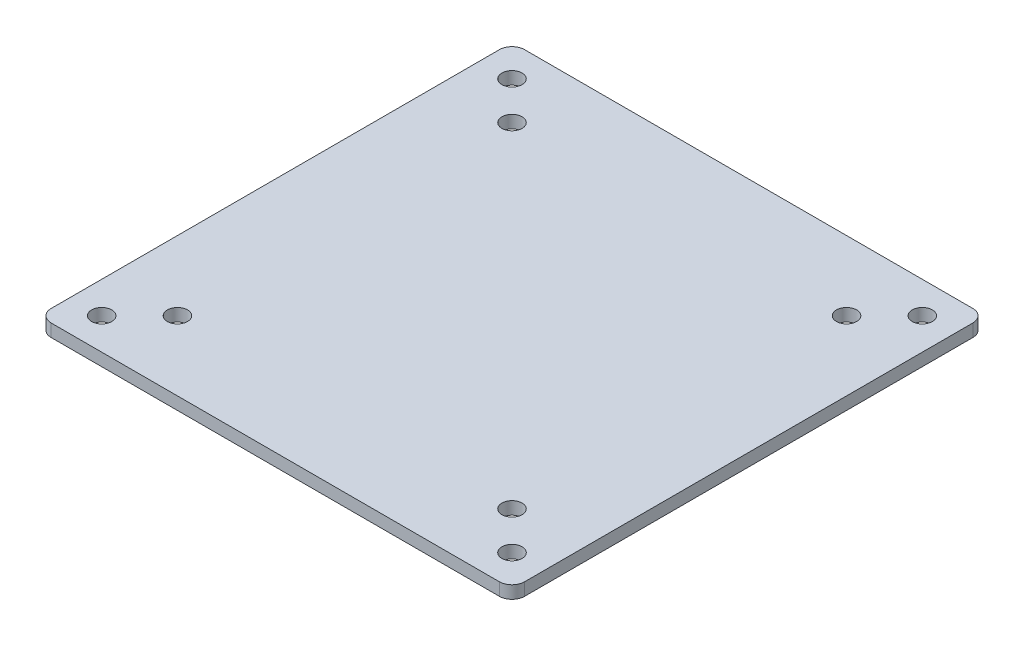
ISO-10303-21;
HEADER;
FILE_DESCRIPTION(('STEP AP214'),'2;1');
FILE_NAME('part.step','',(''),(''),'','','');
FILE_SCHEMA(('AUTOMOTIVE_DESIGN { 1 0 10303 214 1 1 1 1 }'));
ENDSEC;
DATA;
#1=APPLICATION_CONTEXT('core data for automotive mechanical design processes');
#2=APPLICATION_PROTOCOL_DEFINITION('international standard','automotive_design',2000,#1);
#3=PRODUCT_CONTEXT('',#1,'mechanical');
#4=PRODUCT('Part','Part','',(#3));
#5=PRODUCT_RELATED_PRODUCT_CATEGORY('part','',(#4));
#6=PRODUCT_DEFINITION_FORMATION('','',#4);
#7=PRODUCT_DEFINITION_CONTEXT('part definition',#1,'design');
#8=PRODUCT_DEFINITION('design','',#6,#7);
#9=PRODUCT_DEFINITION_SHAPE('','',#8);
#10=(LENGTH_UNIT() NAMED_UNIT(*) SI_UNIT(.MILLI.,.METRE.));
#11=(NAMED_UNIT(*) PLANE_ANGLE_UNIT() SI_UNIT($,.RADIAN.));
#12=(NAMED_UNIT(*) SI_UNIT($,.STERADIAN.) SOLID_ANGLE_UNIT());
#13=UNCERTAINTY_MEASURE_WITH_UNIT(LENGTH_MEASURE(1.E-05),#10,'distance_accuracy_value','');
#14=(GEOMETRIC_REPRESENTATION_CONTEXT(3) GLOBAL_UNCERTAINTY_ASSIGNED_CONTEXT((#13)) GLOBAL_UNIT_ASSIGNED_CONTEXT((#10,
#11,#12)) REPRESENTATION_CONTEXT('',''));
#15=CARTESIAN_POINT('',(0.,0.,0.));
#16=DIRECTION('',(0.,0.,1.));
#17=DIRECTION('',(1.,0.,0.));
#18=AXIS2_PLACEMENT_3D('',#15,#16,#17);
#19=CARTESIAN_POINT('',(0.,2.,0.));
#20=DIRECTION('',(0.,1.,0.));
#21=DIRECTION('',(0.,0.,1.));
#22=AXIS2_PLACEMENT_3D('',#19,#20,#21);
#23=PLANE('',#22);
#24=CARTESIAN_POINT('',(32.5,2.,32.5));
#25=DIRECTION('',(0.,1.,0.));
#26=DIRECTION('',(0.,0.,-1.));
#27=AXIS2_PLACEMENT_3D('',#24,#25,#26);
#28=CIRCLE('',#27,1.59999999999997);
#29=CARTESIAN_POINT('',(32.5,2.,30.9));
#30=VERTEX_POINT('',#29);
#31=EDGE_CURVE('E214',#30,#30,#28,.T.);
#32=ORIENTED_EDGE('',*,*,#31,.F.);
#33=EDGE_LOOP('',(#32));
#34=FACE_BOUND('',#33,.T.);
#35=CARTESIAN_POINT('',(-32.5,2.,-32.5));
#36=DIRECTION('',(0.,1.,0.));
#37=DIRECTION('',(0.,0.,1.));
#38=AXIS2_PLACEMENT_3D('',#35,#36,#37);
#39=CIRCLE('',#38,1.6);
#40=CARTESIAN_POINT('',(-32.5,2.,-30.9));
#41=VERTEX_POINT('',#40);
#42=EDGE_CURVE('E202',#41,#41,#39,.T.);
#43=ORIENTED_EDGE('',*,*,#42,.F.);
#44=EDGE_LOOP('',(#43));
#45=FACE_BOUND('',#44,.T.);
#46=CARTESIAN_POINT('',(26.5,2.,26.5));
#47=DIRECTION('',(0.,1.,0.));
#48=DIRECTION('',(0.,0.,-1.));
#49=AXIS2_PLACEMENT_3D('',#46,#47,#48);
#50=CIRCLE('',#49,1.6);
#51=CARTESIAN_POINT('',(26.5,2.,24.9));
#52=VERTEX_POINT('',#51);
#53=EDGE_CURVE('E190',#52,#52,#50,.T.);
#54=ORIENTED_EDGE('',*,*,#53,.F.);
#55=EDGE_LOOP('',(#54));
#56=FACE_BOUND('',#55,.T.);
#57=CARTESIAN_POINT('',(-26.5,2.,-26.5));
#58=DIRECTION('',(0.,1.,0.));
#59=DIRECTION('',(0.,0.,1.));
#60=AXIS2_PLACEMENT_3D('',#57,#58,#59);
#61=CIRCLE('',#60,1.6);
#62=CARTESIAN_POINT('',(-26.5,2.,-24.9));
#63=VERTEX_POINT('',#62);
#64=EDGE_CURVE('E180',#63,#63,#61,.T.);
#65=ORIENTED_EDGE('',*,*,#64,.F.);
#66=EDGE_LOOP('',(#65));
#67=FACE_BOUND('',#66,.T.);
#68=DIRECTION('',(-1.,0.,0.));
#69=VECTOR('',#68,1.);
#70=CARTESIAN_POINT('',(-37.5,2.,-37.5));
#71=LINE('',#70,#69);
#72=CARTESIAN_POINT('',(35.5,2.,-37.5));
#73=VERTEX_POINT('',#72);
#74=CARTESIAN_POINT('',(-35.5,2.,-37.5));
#75=VERTEX_POINT('',#74);
#76=EDGE_CURVE('E171',#73,#75,#71,.T.);
#77=ORIENTED_EDGE('',*,*,#76,.T.);
#78=CARTESIAN_POINT('',(-35.5,2.,-35.5));
#79=DIRECTION('',(0.,1.,0.));
#80=DIRECTION('',(0.,0.,1.));
#81=AXIS2_PLACEMENT_3D('',#78,#79,#80);
#82=CIRCLE('',#81,2.);
#83=CARTESIAN_POINT('',(-37.5,2.,-35.5));
#84=VERTEX_POINT('',#83);
#85=EDGE_CURVE('E149',#75,#84,#82,.T.);
#86=ORIENTED_EDGE('',*,*,#85,.T.);
#87=DIRECTION('',(0.,0.,1.));
#88=VECTOR('',#87,1.);
#89=CARTESIAN_POINT('',(-37.5,2.,-37.5));
#90=LINE('',#89,#88);
#91=CARTESIAN_POINT('',(-37.5,2.,35.5));
#92=VERTEX_POINT('',#91);
#93=EDGE_CURVE('E119',#84,#92,#90,.T.);
#94=ORIENTED_EDGE('',*,*,#93,.T.);
#95=CARTESIAN_POINT('',(-35.5,2.,35.5));
#96=DIRECTION('',(0.,1.,0.));
#97=DIRECTION('',(0.,0.,1.));
#98=AXIS2_PLACEMENT_3D('',#95,#96,#97);
#99=CIRCLE('',#98,2.);
#100=CARTESIAN_POINT('',(-35.5,2.,37.5));
#101=VERTEX_POINT('',#100);
#102=EDGE_CURVE('E55',#92,#101,#99,.T.);
#103=ORIENTED_EDGE('',*,*,#102,.T.);
#104=DIRECTION('',(1.,0.,0.));
#105=VECTOR('',#104,1.);
#106=CARTESIAN_POINT('',(-37.5,2.,37.5));
#107=LINE('',#106,#105);
#108=CARTESIAN_POINT('',(35.5,2.,37.5));
#109=VERTEX_POINT('',#108);
#110=EDGE_CURVE('E135',#101,#109,#107,.T.);
#111=ORIENTED_EDGE('',*,*,#110,.T.);
#112=CARTESIAN_POINT('',(35.5,2.,35.5));
#113=DIRECTION('',(0.,1.,0.));
#114=DIRECTION('',(0.,0.,1.));
#115=AXIS2_PLACEMENT_3D('',#112,#113,#114);
#116=CIRCLE('',#115,2.);
#117=CARTESIAN_POINT('',(37.5,2.,35.5));
#118=VERTEX_POINT('',#117);
#119=EDGE_CURVE('E145',#109,#118,#116,.T.);
#120=ORIENTED_EDGE('',*,*,#119,.T.);
#121=DIRECTION('',(0.,0.,-1.));
#122=VECTOR('',#121,1.);
#123=CARTESIAN_POINT('',(37.5,2.,-37.5));
#124=LINE('',#123,#122);
#125=CARTESIAN_POINT('',(37.5,2.,-35.5));
#126=VERTEX_POINT('',#125);
#127=EDGE_CURVE('E129',#118,#126,#124,.T.);
#128=ORIENTED_EDGE('',*,*,#127,.T.);
#129=CARTESIAN_POINT('',(35.5,2.,-35.5));
#130=DIRECTION('',(0.,1.,0.));
#131=DIRECTION('',(0.,0.,1.));
#132=AXIS2_PLACEMENT_3D('',#129,#130,#131);
#133=CIRCLE('',#132,2.);
#134=EDGE_CURVE('E147',#126,#73,#133,.T.);
#135=ORIENTED_EDGE('',*,*,#134,.T.);
#136=EDGE_LOOP('',(#77,#86,#94,#103,#111,#120,#128,#135));
#137=FACE_BOUND('',#136,.T.);
#138=CARTESIAN_POINT('',(26.5,2.,-26.5));
#139=DIRECTION('',(0.,1.,0.));
#140=DIRECTION('',(0.,0.,1.));
#141=AXIS2_PLACEMENT_3D('',#138,#139,#140);
#142=CIRCLE('',#141,1.6);
#143=CARTESIAN_POINT('',(26.5,2.,-24.9));
#144=VERTEX_POINT('',#143);
#145=EDGE_CURVE('E185',#144,#144,#142,.T.);
#146=ORIENTED_EDGE('',*,*,#145,.F.);
#147=EDGE_LOOP('',(#146));
#148=FACE_BOUND('',#147,.T.);
#149=CARTESIAN_POINT('',(-26.5,2.,26.5));
#150=DIRECTION('',(0.,1.,0.));
#151=DIRECTION('',(0.,0.,-1.));
#152=AXIS2_PLACEMENT_3D('',#149,#150,#151);
#153=CIRCLE('',#152,1.6);
#154=CARTESIAN_POINT('',(-26.5,2.,24.9));
#155=VERTEX_POINT('',#154);
#156=EDGE_CURVE('E196',#155,#155,#153,.T.);
#157=ORIENTED_EDGE('',*,*,#156,.F.);
#158=EDGE_LOOP('',(#157));
#159=FACE_BOUND('',#158,.T.);
#160=CARTESIAN_POINT('',(32.5,2.,-32.5));
#161=DIRECTION('',(0.,1.,0.));
#162=DIRECTION('',(0.,0.,1.));
#163=AXIS2_PLACEMENT_3D('',#160,#161,#162);
#164=CIRCLE('',#163,1.6);
#165=CARTESIAN_POINT('',(32.5,2.,-30.9));
#166=VERTEX_POINT('',#165);
#167=EDGE_CURVE('E208',#166,#166,#164,.T.);
#168=ORIENTED_EDGE('',*,*,#167,.F.);
#169=EDGE_LOOP('',(#168));
#170=FACE_BOUND('',#169,.T.);
#171=CARTESIAN_POINT('',(-32.5,2.,32.5));
#172=DIRECTION('',(0.,1.,0.));
#173=DIRECTION('',(0.,0.,-1.));
#174=AXIS2_PLACEMENT_3D('',#171,#172,#173);
#175=CIRCLE('',#174,1.59999999999998);
#176=CARTESIAN_POINT('',(-32.5,2.,30.9));
#177=VERTEX_POINT('',#176);
#178=EDGE_CURVE('E220',#177,#177,#175,.T.);
#179=ORIENTED_EDGE('',*,*,#178,.F.);
#180=EDGE_LOOP('',(#179));
#181=FACE_BOUND('',#180,.T.);
#182=ADVANCED_FACE('F35',(#34,#45,#56,#67,#137,#148,#159,#170,#181),#23,.T.);
#183=CARTESIAN_POINT('',(0.,0.,0.));
#184=DIRECTION('',(0.,1.,0.));
#185=DIRECTION('',(0.,0.,1.));
#186=AXIS2_PLACEMENT_3D('',#183,#184,#185);
#187=PLANE('',#186);
#188=DIRECTION('',(0.,0.,1.));
#189=VECTOR('',#188,1.);
#190=CARTESIAN_POINT('',(-37.5,0.,-37.5));
#191=LINE('',#190,#189);
#192=CARTESIAN_POINT('',(-37.5,0.,-35.5));
#193=VERTEX_POINT('',#192);
#194=CARTESIAN_POINT('',(-37.5,0.,35.5));
#195=VERTEX_POINT('',#194);
#196=EDGE_CURVE('E117',#193,#195,#191,.T.);
#197=ORIENTED_EDGE('',*,*,#196,.F.);
#198=CARTESIAN_POINT('',(-35.5,0.,-35.5));
#199=DIRECTION('',(0.,1.,0.));
#200=DIRECTION('',(0.,0.,1.));
#201=AXIS2_PLACEMENT_3D('',#198,#199,#200);
#202=CIRCLE('',#201,2.);
#203=CARTESIAN_POINT('',(-35.5,0.,-37.5));
#204=VERTEX_POINT('',#203);
#205=EDGE_CURVE('E100',#193,#204,#202,.F.);
#206=ORIENTED_EDGE('',*,*,#205,.T.);
#207=DIRECTION('',(-1.,0.,0.));
#208=VECTOR('',#207,1.);
#209=CARTESIAN_POINT('',(-37.5,0.,-37.5));
#210=LINE('',#209,#208);
#211=CARTESIAN_POINT('',(35.5,0.,-37.5));
#212=VERTEX_POINT('',#211);
#213=EDGE_CURVE('E127',#212,#204,#210,.T.);
#214=ORIENTED_EDGE('',*,*,#213,.F.);
#215=CARTESIAN_POINT('',(35.5,0.,-35.5));
#216=DIRECTION('',(0.,1.,0.));
#217=DIRECTION('',(0.,0.,1.));
#218=AXIS2_PLACEMENT_3D('',#215,#216,#217);
#219=CIRCLE('',#218,2.);
#220=CARTESIAN_POINT('',(37.5,0.,-35.5));
#221=VERTEX_POINT('',#220);
#222=EDGE_CURVE('E111',#212,#221,#219,.F.);
#223=ORIENTED_EDGE('',*,*,#222,.T.);
#224=DIRECTION('',(0.,0.,-1.));
#225=VECTOR('',#224,1.);
#226=CARTESIAN_POINT('',(37.5,0.,-37.5));
#227=LINE('',#226,#225);
#228=CARTESIAN_POINT('',(37.5,0.,35.5));
#229=VERTEX_POINT('',#228);
#230=EDGE_CURVE('E131',#229,#221,#227,.T.);
#231=ORIENTED_EDGE('',*,*,#230,.F.);
#232=CARTESIAN_POINT('',(35.5,0.,35.5));
#233=DIRECTION('',(0.,1.,0.));
#234=DIRECTION('',(0.,0.,1.));
#235=AXIS2_PLACEMENT_3D('',#232,#233,#234);
#236=CIRCLE('',#235,2.);
#237=CARTESIAN_POINT('',(35.5,0.,37.5));
#238=VERTEX_POINT('',#237);
#239=EDGE_CURVE('E138',#229,#238,#236,.F.);
#240=ORIENTED_EDGE('',*,*,#239,.T.);
#241=DIRECTION('',(1.,0.,0.));
#242=VECTOR('',#241,1.);
#243=CARTESIAN_POINT('',(-37.5,0.,37.5));
#244=LINE('',#243,#242);
#245=CARTESIAN_POINT('',(-35.5,0.,37.5));
#246=VERTEX_POINT('',#245);
#247=EDGE_CURVE('E126',#246,#238,#244,.T.);
#248=ORIENTED_EDGE('',*,*,#247,.F.);
#249=CARTESIAN_POINT('',(-35.5,0.,35.5));
#250=DIRECTION('',(0.,1.,0.));
#251=DIRECTION('',(0.,0.,1.));
#252=AXIS2_PLACEMENT_3D('',#249,#250,#251);
#253=CIRCLE('',#252,2.);
#254=EDGE_CURVE('E120',#246,#195,#253,.F.);
#255=ORIENTED_EDGE('',*,*,#254,.T.);
#256=EDGE_LOOP('',(#197,#206,#214,#223,#231,#240,#248,#255));
#257=FACE_BOUND('',#256,.T.);
#258=CARTESIAN_POINT('',(-26.5,0.,-26.5));
#259=DIRECTION('',(0.,1.,0.));
#260=DIRECTION('',(0.,0.,1.));
#261=AXIS2_PLACEMENT_3D('',#258,#259,#260);
#262=CIRCLE('',#261,1.6);
#263=CARTESIAN_POINT('',(-26.5,0.,-24.9));
#264=VERTEX_POINT('',#263);
#265=EDGE_CURVE('E176',#264,#264,#262,.T.);
#266=ORIENTED_EDGE('',*,*,#265,.T.);
#267=EDGE_LOOP('',(#266));
#268=FACE_BOUND('',#267,.T.);
#269=CARTESIAN_POINT('',(26.5,0.,-26.5));
#270=DIRECTION('',(0.,1.,0.));
#271=DIRECTION('',(0.,0.,1.));
#272=AXIS2_PLACEMENT_3D('',#269,#270,#271);
#273=CIRCLE('',#272,1.6);
#274=CARTESIAN_POINT('',(26.5,0.,-24.9));
#275=VERTEX_POINT('',#274);
#276=EDGE_CURVE('E187',#275,#275,#273,.T.);
#277=ORIENTED_EDGE('',*,*,#276,.T.);
#278=EDGE_LOOP('',(#277));
#279=FACE_BOUND('',#278,.T.);
#280=CARTESIAN_POINT('',(26.5,0.,26.5));
#281=DIRECTION('',(0.,1.,0.));
#282=DIRECTION('',(0.,0.,-1.));
#283=AXIS2_PLACEMENT_3D('',#280,#281,#282);
#284=CIRCLE('',#283,1.6);
#285=CARTESIAN_POINT('',(26.5,0.,24.9));
#286=VERTEX_POINT('',#285);
#287=EDGE_CURVE('E193',#286,#286,#284,.T.);
#288=ORIENTED_EDGE('',*,*,#287,.T.);
#289=EDGE_LOOP('',(#288));
#290=FACE_BOUND('',#289,.T.);
#291=CARTESIAN_POINT('',(-26.5,0.,26.5));
#292=DIRECTION('',(0.,1.,0.));
#293=DIRECTION('',(0.,0.,-1.));
#294=AXIS2_PLACEMENT_3D('',#291,#292,#293);
#295=CIRCLE('',#294,1.6);
#296=CARTESIAN_POINT('',(-26.5,0.,24.9));
#297=VERTEX_POINT('',#296);
#298=EDGE_CURVE('E199',#297,#297,#295,.T.);
#299=ORIENTED_EDGE('',*,*,#298,.T.);
#300=EDGE_LOOP('',(#299));
#301=FACE_BOUND('',#300,.T.);
#302=CARTESIAN_POINT('',(-32.5,0.,-32.5));
#303=DIRECTION('',(0.,1.,0.));
#304=DIRECTION('',(0.,0.,1.));
#305=AXIS2_PLACEMENT_3D('',#302,#303,#304);
#306=CIRCLE('',#305,1.6);
#307=CARTESIAN_POINT('',(-32.5,0.,-30.9));
#308=VERTEX_POINT('',#307);
#309=EDGE_CURVE('E205',#308,#308,#306,.T.);
#310=ORIENTED_EDGE('',*,*,#309,.T.);
#311=EDGE_LOOP('',(#310));
#312=FACE_BOUND('',#311,.T.);
#313=CARTESIAN_POINT('',(32.5,0.,-32.5));
#314=DIRECTION('',(0.,1.,0.));
#315=DIRECTION('',(0.,0.,1.));
#316=AXIS2_PLACEMENT_3D('',#313,#314,#315);
#317=CIRCLE('',#316,1.6);
#318=CARTESIAN_POINT('',(32.5,0.,-30.9));
#319=VERTEX_POINT('',#318);
#320=EDGE_CURVE('E211',#319,#319,#317,.T.);
#321=ORIENTED_EDGE('',*,*,#320,.T.);
#322=EDGE_LOOP('',(#321));
#323=FACE_BOUND('',#322,.T.);
#324=CARTESIAN_POINT('',(32.5,0.,32.5));
#325=DIRECTION('',(0.,1.,0.));
#326=DIRECTION('',(0.,0.,-1.));
#327=AXIS2_PLACEMENT_3D('',#324,#325,#326);
#328=CIRCLE('',#327,1.59999999999997);
#329=CARTESIAN_POINT('',(32.5,0.,30.9));
#330=VERTEX_POINT('',#329);
#331=EDGE_CURVE('E217',#330,#330,#328,.T.);
#332=ORIENTED_EDGE('',*,*,#331,.T.);
#333=EDGE_LOOP('',(#332));
#334=FACE_BOUND('',#333,.T.);
#335=CARTESIAN_POINT('',(-32.5,0.,32.5));
#336=DIRECTION('',(0.,1.,0.));
#337=DIRECTION('',(0.,0.,-1.));
#338=AXIS2_PLACEMENT_3D('',#335,#336,#337);
#339=CIRCLE('',#338,1.59999999999998);
#340=CARTESIAN_POINT('',(-32.5,0.,30.9));
#341=VERTEX_POINT('',#340);
#342=EDGE_CURVE('E223',#341,#341,#339,.T.);
#343=ORIENTED_EDGE('',*,*,#342,.T.);
#344=EDGE_LOOP('',(#343));
#345=FACE_BOUND('',#344,.T.);
#346=ADVANCED_FACE('F123',(#257,#268,#279,#290,#301,#312,#323,#334,#345),#187,.F.);
#347=CARTESIAN_POINT('',(37.5,2.,-37.5));
#348=DIRECTION('',(-1.,0.,0.));
#349=DIRECTION('',(0.,0.,1.));
#350=AXIS2_PLACEMENT_3D('',#347,#348,#349);
#351=PLANE('',#350);
#352=ORIENTED_EDGE('',*,*,#230,.T.);
#353=DIRECTION('',(0.,-1.,0.));
#354=VECTOR('',#353,1.);
#355=CARTESIAN_POINT('',(37.5,2.,-35.5));
#356=LINE('',#355,#354);
#357=EDGE_CURVE('E154',#221,#126,#356,.F.);
#358=ORIENTED_EDGE('',*,*,#357,.T.);
#359=ORIENTED_EDGE('',*,*,#127,.F.);
#360=DIRECTION('',(0.,-1.,0.));
#361=VECTOR('',#360,1.);
#362=CARTESIAN_POINT('',(37.5,2.,35.5));
#363=LINE('',#362,#361);
#364=EDGE_CURVE('E151',#118,#229,#363,.T.);
#365=ORIENTED_EDGE('',*,*,#364,.T.);
#366=EDGE_LOOP('',(#352,#358,#359,#365));
#367=FACE_BOUND('',#366,.T.);
#368=ADVANCED_FACE('F167',(#367),#351,.F.);
#369=CARTESIAN_POINT('',(-37.5,2.,-37.5));
#370=DIRECTION('',(0.,0.,1.));
#371=DIRECTION('',(1.,0.,0.));
#372=AXIS2_PLACEMENT_3D('',#369,#370,#371);
#373=PLANE('',#372);
#374=ORIENTED_EDGE('',*,*,#213,.T.);
#375=DIRECTION('',(0.,-1.,0.));
#376=VECTOR('',#375,1.);
#377=CARTESIAN_POINT('',(-35.5,2.,-37.5));
#378=LINE('',#377,#376);
#379=EDGE_CURVE('E105',#204,#75,#378,.F.);
#380=ORIENTED_EDGE('',*,*,#379,.T.);
#381=ORIENTED_EDGE('',*,*,#76,.F.);
#382=DIRECTION('',(0.,-1.,0.));
#383=VECTOR('',#382,1.);
#384=CARTESIAN_POINT('',(35.5,2.,-37.5));
#385=LINE('',#384,#383);
#386=EDGE_CURVE('E110',#73,#212,#385,.T.);
#387=ORIENTED_EDGE('',*,*,#386,.T.);
#388=EDGE_LOOP('',(#374,#380,#381,#387));
#389=FACE_BOUND('',#388,.T.);
#390=ADVANCED_FACE('F249',(#389),#373,.F.);
#391=CARTESIAN_POINT('',(-37.5,2.,-37.5));
#392=DIRECTION('',(1.,0.,0.));
#393=DIRECTION('',(0.,0.,-1.));
#394=AXIS2_PLACEMENT_3D('',#391,#392,#393);
#395=PLANE('',#394);
#396=ORIENTED_EDGE('',*,*,#93,.F.);
#397=DIRECTION('',(0.,-1.,0.));
#398=VECTOR('',#397,1.);
#399=CARTESIAN_POINT('',(-37.5,2.,-35.5));
#400=LINE('',#399,#398);
#401=EDGE_CURVE('E104',#84,#193,#400,.T.);
#402=ORIENTED_EDGE('',*,*,#401,.T.);
#403=ORIENTED_EDGE('',*,*,#196,.T.);
#404=DIRECTION('',(0.,-1.,0.));
#405=VECTOR('',#404,1.);
#406=CARTESIAN_POINT('',(-37.5,2.,35.5));
#407=LINE('',#406,#405);
#408=EDGE_CURVE('E121',#195,#92,#407,.F.);
#409=ORIENTED_EDGE('',*,*,#408,.T.);
#410=EDGE_LOOP('',(#396,#402,#403,#409));
#411=FACE_BOUND('',#410,.T.);
#412=ADVANCED_FACE('F116',(#411),#395,.F.);
#413=CARTESIAN_POINT('',(-37.5,2.,37.5));
#414=DIRECTION('',(0.,0.,-1.));
#415=DIRECTION('',(-1.,0.,0.));
#416=AXIS2_PLACEMENT_3D('',#413,#414,#415);
#417=PLANE('',#416);
#418=ORIENTED_EDGE('',*,*,#247,.T.);
#419=DIRECTION('',(0.,-1.,0.));
#420=VECTOR('',#419,1.);
#421=CARTESIAN_POINT('',(35.5,2.,37.5));
#422=LINE('',#421,#420);
#423=EDGE_CURVE('E11',#238,#109,#422,.F.);
#424=ORIENTED_EDGE('',*,*,#423,.T.);
#425=ORIENTED_EDGE('',*,*,#110,.F.);
#426=DIRECTION('',(0.,-1.,0.));
#427=VECTOR('',#426,1.);
#428=CARTESIAN_POINT('',(-35.5,2.,37.5));
#429=LINE('',#428,#427);
#430=EDGE_CURVE('E43',#101,#246,#429,.T.);
#431=ORIENTED_EDGE('',*,*,#430,.T.);
#432=EDGE_LOOP('',(#418,#424,#425,#431));
#433=FACE_BOUND('',#432,.T.);
#434=ADVANCED_FACE('F157',(#433),#417,.F.);
#435=CARTESIAN_POINT('',(-26.5,2.,-26.5));
#436=DIRECTION('',(0.,-1.,0.));
#437=DIRECTION('',(0.,0.,-1.));
#438=AXIS2_PLACEMENT_3D('',#435,#436,#437);
#439=CYLINDRICAL_SURFACE('',#438,1.6);
#440=ORIENTED_EDGE('',*,*,#64,.T.);
#441=EDGE_LOOP('',(#440));
#442=FACE_BOUND('',#441,.T.);
#443=ORIENTED_EDGE('',*,*,#265,.F.);
#444=EDGE_LOOP('',(#443));
#445=FACE_BOUND('',#444,.T.);
#446=ADVANCED_FACE('F242',(#442,#445),#439,.F.);
#447=CARTESIAN_POINT('',(26.5,2.,-26.5));
#448=DIRECTION('',(0.,-1.,0.));
#449=DIRECTION('',(0.,0.,-1.));
#450=AXIS2_PLACEMENT_3D('',#447,#448,#449);
#451=CYLINDRICAL_SURFACE('',#450,1.6);
#452=ORIENTED_EDGE('',*,*,#145,.T.);
#453=EDGE_LOOP('',(#452));
#454=FACE_BOUND('',#453,.T.);
#455=ORIENTED_EDGE('',*,*,#276,.F.);
#456=EDGE_LOOP('',(#455));
#457=FACE_BOUND('',#456,.T.);
#458=ADVANCED_FACE('F304',(#454,#457),#451,.F.);
#459=CARTESIAN_POINT('',(26.5,2.,26.5));
#460=DIRECTION('',(0.,-1.,0.));
#461=DIRECTION('',(0.,0.,-1.));
#462=AXIS2_PLACEMENT_3D('',#459,#460,#461);
#463=CYLINDRICAL_SURFACE('',#462,1.6);
#464=ORIENTED_EDGE('',*,*,#53,.T.);
#465=EDGE_LOOP('',(#464));
#466=FACE_BOUND('',#465,.T.);
#467=ORIENTED_EDGE('',*,*,#287,.F.);
#468=EDGE_LOOP('',(#467));
#469=FACE_BOUND('',#468,.T.);
#470=ADVANCED_FACE('F301',(#466,#469),#463,.F.);
#471=CARTESIAN_POINT('',(-26.5,2.,26.5));
#472=DIRECTION('',(0.,-1.,0.));
#473=DIRECTION('',(0.,0.,-1.));
#474=AXIS2_PLACEMENT_3D('',#471,#472,#473);
#475=CYLINDRICAL_SURFACE('',#474,1.6);
#476=ORIENTED_EDGE('',*,*,#156,.T.);
#477=EDGE_LOOP('',(#476));
#478=FACE_BOUND('',#477,.T.);
#479=ORIENTED_EDGE('',*,*,#298,.F.);
#480=EDGE_LOOP('',(#479));
#481=FACE_BOUND('',#480,.T.);
#482=ADVANCED_FACE('F297',(#478,#481),#475,.F.);
#483=CARTESIAN_POINT('',(-32.5,2.,-32.5));
#484=DIRECTION('',(0.,-1.,0.));
#485=DIRECTION('',(0.,0.,-1.));
#486=AXIS2_PLACEMENT_3D('',#483,#484,#485);
#487=CYLINDRICAL_SURFACE('',#486,1.6);
#488=ORIENTED_EDGE('',*,*,#42,.T.);
#489=EDGE_LOOP('',(#488));
#490=FACE_BOUND('',#489,.T.);
#491=ORIENTED_EDGE('',*,*,#309,.F.);
#492=EDGE_LOOP('',(#491));
#493=FACE_BOUND('',#492,.T.);
#494=ADVANCED_FACE('F279',(#490,#493),#487,.F.);
#495=CARTESIAN_POINT('',(32.5,2.,-32.5));
#496=DIRECTION('',(0.,-1.,0.));
#497=DIRECTION('',(0.,0.,-1.));
#498=AXIS2_PLACEMENT_3D('',#495,#496,#497);
#499=CYLINDRICAL_SURFACE('',#498,1.6);
#500=ORIENTED_EDGE('',*,*,#167,.T.);
#501=EDGE_LOOP('',(#500));
#502=FACE_BOUND('',#501,.T.);
#503=ORIENTED_EDGE('',*,*,#320,.F.);
#504=EDGE_LOOP('',(#503));
#505=FACE_BOUND('',#504,.T.);
#506=ADVANCED_FACE('F275',(#502,#505),#499,.F.);
#507=CARTESIAN_POINT('',(32.5,2.,32.5));
#508=DIRECTION('',(0.,-1.,0.));
#509=DIRECTION('',(0.,0.,-1.));
#510=AXIS2_PLACEMENT_3D('',#507,#508,#509);
#511=CYLINDRICAL_SURFACE('',#510,1.59999999999997);
#512=ORIENTED_EDGE('',*,*,#31,.T.);
#513=EDGE_LOOP('',(#512));
#514=FACE_BOUND('',#513,.T.);
#515=ORIENTED_EDGE('',*,*,#331,.F.);
#516=EDGE_LOOP('',(#515));
#517=FACE_BOUND('',#516,.T.);
#518=ADVANCED_FACE('F278',(#514,#517),#511,.F.);
#519=CARTESIAN_POINT('',(-32.5,2.,32.5));
#520=DIRECTION('',(0.,-1.,0.));
#521=DIRECTION('',(0.,0.,-1.));
#522=AXIS2_PLACEMENT_3D('',#519,#520,#521);
#523=CYLINDRICAL_SURFACE('',#522,1.59999999999998);
#524=ORIENTED_EDGE('',*,*,#178,.T.);
#525=EDGE_LOOP('',(#524));
#526=FACE_BOUND('',#525,.T.);
#527=ORIENTED_EDGE('',*,*,#342,.F.);
#528=EDGE_LOOP('',(#527));
#529=FACE_BOUND('',#528,.T.);
#530=ADVANCED_FACE('F229',(#526,#529),#523,.F.);
#531=CARTESIAN_POINT('',(-35.5,2.,-35.5));
#532=DIRECTION('',(0.,-1.,0.));
#533=DIRECTION('',(0.,0.,-1.));
#534=AXIS2_PLACEMENT_3D('',#531,#532,#533);
#535=CYLINDRICAL_SURFACE('',#534,2.);
#536=ORIENTED_EDGE('',*,*,#85,.F.);
#537=ORIENTED_EDGE('',*,*,#379,.F.);
#538=ORIENTED_EDGE('',*,*,#205,.F.);
#539=ORIENTED_EDGE('',*,*,#401,.F.);
#540=EDGE_LOOP('',(#536,#537,#538,#539));
#541=FACE_BOUND('',#540,.T.);
#542=ADVANCED_FACE('F103',(#541),#535,.T.);
#543=CARTESIAN_POINT('',(35.5,2.,-35.5));
#544=DIRECTION('',(0.,-1.,0.));
#545=DIRECTION('',(0.,0.,-1.));
#546=AXIS2_PLACEMENT_3D('',#543,#544,#545);
#547=CYLINDRICAL_SURFACE('',#546,2.);
#548=ORIENTED_EDGE('',*,*,#134,.F.);
#549=ORIENTED_EDGE('',*,*,#357,.F.);
#550=ORIENTED_EDGE('',*,*,#222,.F.);
#551=ORIENTED_EDGE('',*,*,#386,.F.);
#552=EDGE_LOOP('',(#548,#549,#550,#551));
#553=FACE_BOUND('',#552,.T.);
#554=ADVANCED_FACE('F257',(#553),#547,.T.);
#555=CARTESIAN_POINT('',(35.5,2.,35.5));
#556=DIRECTION('',(0.,-1.,0.));
#557=DIRECTION('',(0.,0.,-1.));
#558=AXIS2_PLACEMENT_3D('',#555,#556,#557);
#559=CYLINDRICAL_SURFACE('',#558,2.);
#560=ORIENTED_EDGE('',*,*,#119,.F.);
#561=ORIENTED_EDGE('',*,*,#423,.F.);
#562=ORIENTED_EDGE('',*,*,#239,.F.);
#563=ORIENTED_EDGE('',*,*,#364,.F.);
#564=EDGE_LOOP('',(#560,#561,#562,#563));
#565=FACE_BOUND('',#564,.T.);
#566=ADVANCED_FACE('F164',(#565),#559,.T.);
#567=CARTESIAN_POINT('',(-35.5,2.,35.5));
#568=DIRECTION('',(0.,-1.,0.));
#569=DIRECTION('',(0.,0.,-1.));
#570=AXIS2_PLACEMENT_3D('',#567,#568,#569);
#571=CYLINDRICAL_SURFACE('',#570,2.);
#572=ORIENTED_EDGE('',*,*,#102,.F.);
#573=ORIENTED_EDGE('',*,*,#408,.F.);
#574=ORIENTED_EDGE('',*,*,#254,.F.);
#575=ORIENTED_EDGE('',*,*,#430,.F.);
#576=EDGE_LOOP('',(#572,#573,#574,#575));
#577=FACE_BOUND('',#576,.T.);
#578=ADVANCED_FACE('F37',(#577),#571,.T.);
#579=CLOSED_SHELL('',(#182,#346,#368,#390,#412,#434,#446,#458,#470,#482,#494,#506,#518,#530,
#542,#554,#566,#578));
#580=MANIFOLD_SOLID_BREP('B2',#579);
#581=ADVANCED_BREP_SHAPE_REPRESENTATION('',(#18,#580),#14);
#582=SHAPE_DEFINITION_REPRESENTATION(#9,#581);
ENDSEC;
END-ISO-10303-21;
